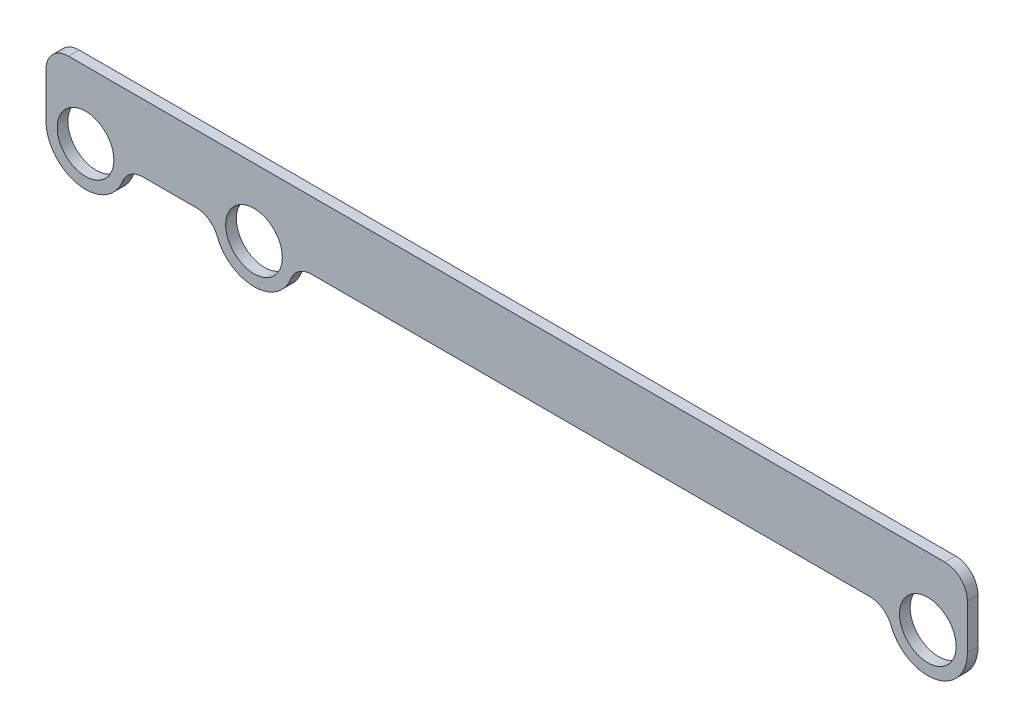
ISO-10303-21;
HEADER;
FILE_DESCRIPTION(('STEP AP214'),'2;1');
FILE_NAME('part.step','',(''),(''),'','','');
FILE_SCHEMA(('AUTOMOTIVE_DESIGN { 1 0 10303 214 1 1 1 1 }'));
ENDSEC;
DATA;
#1=APPLICATION_CONTEXT('core data for automotive mechanical design processes');
#2=APPLICATION_PROTOCOL_DEFINITION('international standard','automotive_design',2000,#1);
#3=PRODUCT_CONTEXT('',#1,'mechanical');
#4=PRODUCT('Part','Part','',(#3));
#5=PRODUCT_RELATED_PRODUCT_CATEGORY('part','',(#4));
#6=PRODUCT_DEFINITION_FORMATION('','',#4);
#7=PRODUCT_DEFINITION_CONTEXT('part definition',#1,'design');
#8=PRODUCT_DEFINITION('design','',#6,#7);
#9=PRODUCT_DEFINITION_SHAPE('','',#8);
#10=(LENGTH_UNIT() NAMED_UNIT(*) SI_UNIT(.MILLI.,.METRE.));
#11=(NAMED_UNIT(*) PLANE_ANGLE_UNIT() SI_UNIT($,.RADIAN.));
#12=(NAMED_UNIT(*) SI_UNIT($,.STERADIAN.) SOLID_ANGLE_UNIT());
#13=UNCERTAINTY_MEASURE_WITH_UNIT(LENGTH_MEASURE(1.E-05),#10,'distance_accuracy_value','');
#14=(GEOMETRIC_REPRESENTATION_CONTEXT(3) GLOBAL_UNCERTAINTY_ASSIGNED_CONTEXT((#13)) GLOBAL_UNIT_ASSIGNED_CONTEXT((#10,
#11,#12)) REPRESENTATION_CONTEXT('',''));
#15=CARTESIAN_POINT('',(0.,0.,0.));
#16=DIRECTION('',(0.,0.,1.));
#17=DIRECTION('',(1.,0.,0.));
#18=AXIS2_PLACEMENT_3D('',#15,#16,#17);
#19=CARTESIAN_POINT('',(375.13611527834,-12.8083458350186,-9.5));
#20=DIRECTION('',(0.,0.,1.));
#21=DIRECTION('',(1.,0.,0.));
#22=AXIS2_PLACEMENT_3D('',#19,#20,#21);
#23=CYLINDRICAL_SURFACE('',#22,35.1999999999999);
#24=CARTESIAN_POINT('',(375.13611527834,-12.8083458350186,0.));
#25=DIRECTION('',(0.,0.,1.));
#26=DIRECTION('',(1.,0.,0.));
#27=AXIS2_PLACEMENT_3D('',#24,#25,#26);
#28=CIRCLE('',#27,35.1999999999999);
#29=CARTESIAN_POINT('',(342.327806946941,-25.5619690234244,0.));
#30=VERTEX_POINT('',#29);
#31=CARTESIAN_POINT('',(410.33611527834,-12.8083458350186,0.));
#32=VERTEX_POINT('',#31);
#33=EDGE_CURVE('E189',#30,#32,#28,.T.);
#34=ORIENTED_EDGE('',*,*,#33,.F.);
#35=DIRECTION('',(0.,0.,1.));
#36=VECTOR('',#35,1.);
#37=CARTESIAN_POINT('',(342.327806946941,-25.5619690234244,-9.5));
#38=LINE('',#37,#36);
#39=CARTESIAN_POINT('',(342.327806946941,-25.5619690234244,-9.5));
#40=VERTEX_POINT('',#39);
#41=EDGE_CURVE('E153',#30,#40,#38,.F.);
#42=ORIENTED_EDGE('',*,*,#41,.T.);
#43=CARTESIAN_POINT('',(375.13611527834,-12.8083458350186,-9.5));
#44=DIRECTION('',(0.,0.,1.));
#45=DIRECTION('',(1.,0.,0.));
#46=AXIS2_PLACEMENT_3D('',#43,#44,#45);
#47=CIRCLE('',#46,35.1999999999999);
#48=CARTESIAN_POINT('',(410.33611527834,-12.8083458350186,-9.5));
#49=VERTEX_POINT('',#48);
#50=EDGE_CURVE('E150',#40,#49,#47,.T.);
#51=ORIENTED_EDGE('',*,*,#50,.T.);
#52=DIRECTION('',(0.,0.,1.));
#53=VECTOR('',#52,1.);
#54=CARTESIAN_POINT('',(410.33611527834,-12.8083458350186,-9.5));
#55=LINE('',#54,#53);
#56=EDGE_CURVE('E147',#49,#32,#55,.T.);
#57=ORIENTED_EDGE('',*,*,#56,.T.);
#58=EDGE_LOOP('',(#34,#42,#51,#57));
#59=FACE_BOUND('',#58,.T.);
#60=ADVANCED_FACE('F44',(#59),#23,.T.);
#61=CARTESIAN_POINT('',(-189.66388472166,-12.8083458350188,-9.5));
#62=DIRECTION('',(0.,-1.,0.));
#63=DIRECTION('',(1.,0.,0.));
#64=AXIS2_PLACEMENT_3D('',#61,#62,#63);
#65=PLANE('',#64);
#66=DIRECTION('',(1.,0.,0.));
#67=VECTOR('',#66,1.);
#68=CARTESIAN_POINT('',(-189.66388472166,-12.8083458350188,-9.5));
#69=LINE('',#68,#67);
#70=CARTESIAN_POINT('',(-173.414492111057,-12.8083458350188,-9.5));
#71=VERTEX_POINT('',#70);
#72=CARTESIAN_POINT('',(323.686722667737,-12.8083458350186,-9.5));
#73=VERTEX_POINT('',#72);
#74=EDGE_CURVE('E170',#71,#73,#69,.T.);
#75=ORIENTED_EDGE('',*,*,#74,.T.);
#76=DIRECTION('',(0.,0.,-1.));
#77=VECTOR('',#76,1.);
#78=CARTESIAN_POINT('',(323.686722667737,-12.8083458350186,0.));
#79=LINE('',#78,#77);
#80=CARTESIAN_POINT('',(323.686722667737,-12.8083458350186,0.));
#81=VERTEX_POINT('',#80);
#82=EDGE_CURVE('E212',#73,#81,#79,.F.);
#83=ORIENTED_EDGE('',*,*,#82,.T.);
#84=DIRECTION('',(1.,0.,0.));
#85=VECTOR('',#84,1.);
#86=CARTESIAN_POINT('',(-189.66388472166,-12.8083458350188,0.));
#87=LINE('',#86,#85);
#88=CARTESIAN_POINT('',(-173.414492111057,-12.8083458350188,0.));
#89=VERTEX_POINT('',#88);
#90=EDGE_CURVE('E160',#89,#81,#87,.T.);
#91=ORIENTED_EDGE('',*,*,#90,.F.);
#92=DIRECTION('',(0.,0.,-1.));
#93=VECTOR('',#92,1.);
#94=CARTESIAN_POINT('',(-173.414492111057,-12.8083458350188,-9.5));
#95=LINE('',#94,#93);
#96=EDGE_CURVE('E211',#89,#71,#95,.T.);
#97=ORIENTED_EDGE('',*,*,#96,.T.);
#98=EDGE_LOOP('',(#75,#83,#91,#97));
#99=FACE_BOUND('',#98,.T.);
#100=ADVANCED_FACE('F289',(#99),#65,.T.);
#101=CARTESIAN_POINT('',(-224.86388472166,-12.8083458350188,-9.5));
#102=DIRECTION('',(0.,0.,1.));
#103=DIRECTION('',(1.,0.,0.));
#104=AXIS2_PLACEMENT_3D('',#101,#102,#103);
#105=CYLINDRICAL_SURFACE('',#104,35.1999999999999);
#106=CARTESIAN_POINT('',(-224.86388472166,-12.8083458350188,-9.5));
#107=DIRECTION('',(0.,0.,1.));
#108=DIRECTION('',(1.,0.,0.));
#109=AXIS2_PLACEMENT_3D('',#106,#107,#108);
#110=CIRCLE('',#109,35.1999999999999);
#111=CARTESIAN_POINT('',(-257.672193053059,-25.5619690234246,-9.5));
#112=VERTEX_POINT('',#111);
#113=CARTESIAN_POINT('',(-192.055576390261,-25.5619690234246,-9.5));
#114=VERTEX_POINT('',#113);
#115=EDGE_CURVE('E183',#112,#114,#110,.T.);
#116=ORIENTED_EDGE('',*,*,#115,.T.);
#117=DIRECTION('',(0.,0.,1.));
#118=VECTOR('',#117,1.);
#119=CARTESIAN_POINT('',(-192.055576390261,-25.5619690234246,-9.5));
#120=LINE('',#119,#118);
#121=CARTESIAN_POINT('',(-192.055576390261,-25.5619690234246,0.));
#122=VERTEX_POINT('',#121);
#123=EDGE_CURVE('E219',#114,#122,#120,.T.);
#124=ORIENTED_EDGE('',*,*,#123,.T.);
#125=CARTESIAN_POINT('',(-224.86388472166,-12.8083458350188,0.));
#126=DIRECTION('',(0.,0.,1.));
#127=DIRECTION('',(1.,0.,0.));
#128=AXIS2_PLACEMENT_3D('',#125,#126,#127);
#129=CIRCLE('',#128,35.1999999999999);
#130=CARTESIAN_POINT('',(-257.672193053059,-25.5619690234246,0.));
#131=VERTEX_POINT('',#130);
#132=EDGE_CURVE('E202',#131,#122,#129,.T.);
#133=ORIENTED_EDGE('',*,*,#132,.F.);
#134=DIRECTION('',(0.,0.,1.));
#135=VECTOR('',#134,1.);
#136=CARTESIAN_POINT('',(-257.672193053059,-25.5619690234246,-9.5));
#137=LINE('',#136,#135);
#138=EDGE_CURVE('E217',#131,#112,#137,.F.);
#139=ORIENTED_EDGE('',*,*,#138,.T.);
#140=EDGE_LOOP('',(#116,#124,#133,#139));
#141=FACE_BOUND('',#140,.T.);
#142=ADVANCED_FACE('F296',(#141),#105,.T.);
#143=CARTESIAN_POINT('',(-339.66388472166,-12.8083458350189,-9.5));
#144=DIRECTION('',(0.,-1.,0.));
#145=DIRECTION('',(1.,0.,0.));
#146=AXIS2_PLACEMENT_3D('',#143,#144,#145);
#147=PLANE('',#146);
#148=DIRECTION('',(1.,0.,0.));
#149=VECTOR('',#148,1.);
#150=CARTESIAN_POINT('',(-339.66388472166,-12.8083458350189,-9.5));
#151=LINE('',#150,#149);
#152=CARTESIAN_POINT('',(-323.414492111057,-12.8083458350189,-9.5));
#153=VERTEX_POINT('',#152);
#154=CARTESIAN_POINT('',(-276.313277332263,-12.8083458350188,-9.5));
#155=VERTEX_POINT('',#154);
#156=EDGE_CURVE('E185',#153,#155,#151,.T.);
#157=ORIENTED_EDGE('',*,*,#156,.T.);
#158=DIRECTION('',(0.,0.,-1.));
#159=VECTOR('',#158,1.);
#160=CARTESIAN_POINT('',(-276.313277332263,-12.8083458350188,0.));
#161=LINE('',#160,#159);
#162=CARTESIAN_POINT('',(-276.313277332263,-12.8083458350188,0.));
#163=VERTEX_POINT('',#162);
#164=EDGE_CURVE('E223',#155,#163,#161,.F.);
#165=ORIENTED_EDGE('',*,*,#164,.T.);
#166=DIRECTION('',(1.,0.,0.));
#167=VECTOR('',#166,1.);
#168=CARTESIAN_POINT('',(-339.66388472166,-12.8083458350189,0.));
#169=LINE('',#168,#167);
#170=CARTESIAN_POINT('',(-323.414492111057,-12.8083458350189,0.));
#171=VERTEX_POINT('',#170);
#172=EDGE_CURVE('E205',#171,#163,#169,.T.);
#173=ORIENTED_EDGE('',*,*,#172,.F.);
#174=DIRECTION('',(0.,0.,-1.));
#175=VECTOR('',#174,1.);
#176=CARTESIAN_POINT('',(-323.414492111057,-12.8083458350189,-9.5));
#177=LINE('',#176,#175);
#178=EDGE_CURVE('E224',#171,#153,#177,.T.);
#179=ORIENTED_EDGE('',*,*,#178,.T.);
#180=EDGE_LOOP('',(#157,#165,#173,#179));
#181=FACE_BOUND('',#180,.T.);
#182=ADVANCED_FACE('F262',(#181),#147,.T.);
#183=CARTESIAN_POINT('',(-374.86388472166,-12.8083458350189,-9.5));
#184=DIRECTION('',(0.,0.,1.));
#185=DIRECTION('',(1.,0.,0.));
#186=AXIS2_PLACEMENT_3D('',#183,#184,#185);
#187=CYLINDRICAL_SURFACE('',#186,35.2);
#188=CARTESIAN_POINT('',(-374.86388472166,-12.8083458350189,-9.5));
#189=DIRECTION('',(0.,0.,1.));
#190=DIRECTION('',(1.,0.,0.));
#191=AXIS2_PLACEMENT_3D('',#188,#189,#190);
#192=CIRCLE('',#191,35.2);
#193=CARTESIAN_POINT('',(-410.06388472166,-12.8083458350189,-9.5));
#194=VERTEX_POINT('',#193);
#195=CARTESIAN_POINT('',(-342.055576390261,-25.5619690234247,-9.5));
#196=VERTEX_POINT('',#195);
#197=EDGE_CURVE('E177',#194,#196,#192,.T.);
#198=ORIENTED_EDGE('',*,*,#197,.T.);
#199=DIRECTION('',(0.,0.,1.));
#200=VECTOR('',#199,1.);
#201=CARTESIAN_POINT('',(-342.055576390261,-25.5619690234247,-9.5));
#202=LINE('',#201,#200);
#203=CARTESIAN_POINT('',(-342.055576390261,-25.5619690234247,0.));
#204=VERTEX_POINT('',#203);
#205=EDGE_CURVE('E227',#196,#204,#202,.T.);
#206=ORIENTED_EDGE('',*,*,#205,.T.);
#207=CARTESIAN_POINT('',(-374.86388472166,-12.8083458350189,0.));
#208=DIRECTION('',(0.,0.,1.));
#209=DIRECTION('',(1.,0.,0.));
#210=AXIS2_PLACEMENT_3D('',#207,#208,#209);
#211=CIRCLE('',#210,35.2);
#212=CARTESIAN_POINT('',(-410.06388472166,-12.8083458350189,0.));
#213=VERTEX_POINT('',#212);
#214=EDGE_CURVE('E200',#213,#204,#211,.T.);
#215=ORIENTED_EDGE('',*,*,#214,.F.);
#216=DIRECTION('',(0.,0.,1.));
#217=VECTOR('',#216,1.);
#218=CARTESIAN_POINT('',(-410.06388472166,-12.8083458350189,-9.5));
#219=LINE('',#218,#217);
#220=EDGE_CURVE('E167',#194,#213,#219,.T.);
#221=ORIENTED_EDGE('',*,*,#220,.F.);
#222=EDGE_LOOP('',(#198,#206,#215,#221));
#223=FACE_BOUND('',#222,.T.);
#224=ADVANCED_FACE('F275',(#223),#187,.T.);
#225=CARTESIAN_POINT('',(-410.06388472166,47.1916541649812,-9.5));
#226=DIRECTION('',(-1.,0.,0.));
#227=DIRECTION('',(0.,0.,1.));
#228=AXIS2_PLACEMENT_3D('',#225,#226,#227);
#229=PLANE('',#228);
#230=DIRECTION('',(0.,-1.,0.));
#231=VECTOR('',#230,1.);
#232=CARTESIAN_POINT('',(-410.06388472166,47.1916541649812,0.));
#233=LINE('',#232,#231);
#234=CARTESIAN_POINT('',(-410.06388472166,27.1916541649812,0.));
#235=VERTEX_POINT('',#234);
#236=EDGE_CURVE('E197',#235,#213,#233,.T.);
#237=ORIENTED_EDGE('',*,*,#236,.F.);
#238=DIRECTION('',(0.,0.,1.));
#239=VECTOR('',#238,1.);
#240=CARTESIAN_POINT('',(-410.06388472166,27.1916541649812,-9.5));
#241=LINE('',#240,#239);
#242=CARTESIAN_POINT('',(-410.06388472166,27.1916541649812,-9.5));
#243=VERTEX_POINT('',#242);
#244=EDGE_CURVE('E58',#235,#243,#241,.F.);
#245=ORIENTED_EDGE('',*,*,#244,.T.);
#246=DIRECTION('',(0.,-1.,0.));
#247=VECTOR('',#246,1.);
#248=CARTESIAN_POINT('',(-410.06388472166,47.1916541649812,-9.5));
#249=LINE('',#248,#247);
#250=EDGE_CURVE('E175',#243,#194,#249,.T.);
#251=ORIENTED_EDGE('',*,*,#250,.T.);
#252=ORIENTED_EDGE('',*,*,#220,.T.);
#253=EDGE_LOOP('',(#237,#245,#251,#252));
#254=FACE_BOUND('',#253,.T.);
#255=ADVANCED_FACE('F272',(#254),#229,.T.);
#256=CARTESIAN_POINT('',(410.33611527834,47.1916541649812,-9.5));
#257=DIRECTION('',(0.,1.,0.));
#258=DIRECTION('',(0.,0.,1.));
#259=AXIS2_PLACEMENT_3D('',#256,#257,#258);
#260=PLANE('',#259);
#261=DIRECTION('',(-1.,0.,0.));
#262=VECTOR('',#261,1.);
#263=CARTESIAN_POINT('',(410.33611527834,47.1916541649812,0.));
#264=LINE('',#263,#262);
#265=CARTESIAN_POINT('',(390.33611527834,47.1916541649812,0.));
#266=VERTEX_POINT('',#265);
#267=CARTESIAN_POINT('',(-390.06388472166,47.1916541649812,0.));
#268=VERTEX_POINT('',#267);
#269=EDGE_CURVE('E192',#266,#268,#264,.T.);
#270=ORIENTED_EDGE('',*,*,#269,.F.);
#271=DIRECTION('',(0.,0.,1.));
#272=VECTOR('',#271,1.);
#273=CARTESIAN_POINT('',(390.33611527834,47.1916541649812,-9.5));
#274=LINE('',#273,#272);
#275=CARTESIAN_POINT('',(390.33611527834,47.1916541649812,-9.5));
#276=VERTEX_POINT('',#275);
#277=EDGE_CURVE('E238',#266,#276,#274,.F.);
#278=ORIENTED_EDGE('',*,*,#277,.T.);
#279=DIRECTION('',(-1.,0.,0.));
#280=VECTOR('',#279,1.);
#281=CARTESIAN_POINT('',(410.33611527834,47.1916541649812,-9.5));
#282=LINE('',#281,#280);
#283=CARTESIAN_POINT('',(-390.06388472166,47.1916541649812,-9.5));
#284=VERTEX_POINT('',#283);
#285=EDGE_CURVE('E174',#276,#284,#282,.T.);
#286=ORIENTED_EDGE('',*,*,#285,.T.);
#287=DIRECTION('',(0.,0.,1.));
#288=VECTOR('',#287,1.);
#289=CARTESIAN_POINT('',(-390.06388472166,47.1916541649812,-9.5));
#290=LINE('',#289,#288);
#291=EDGE_CURVE('E240',#284,#268,#290,.T.);
#292=ORIENTED_EDGE('',*,*,#291,.T.);
#293=EDGE_LOOP('',(#270,#278,#286,#292));
#294=FACE_BOUND('',#293,.T.);
#295=ADVANCED_FACE('F279',(#294),#260,.T.);
#296=CARTESIAN_POINT('',(410.33611527834,-12.8083458350186,-9.5));
#297=DIRECTION('',(1.,0.,0.));
#298=DIRECTION('',(0.,0.,-1.));
#299=AXIS2_PLACEMENT_3D('',#296,#297,#298);
#300=PLANE('',#299);
#301=DIRECTION('',(0.,1.,0.));
#302=VECTOR('',#301,1.);
#303=CARTESIAN_POINT('',(410.33611527834,-12.8083458350186,-9.5));
#304=LINE('',#303,#302);
#305=CARTESIAN_POINT('',(410.33611527834,27.1916541649812,-9.5));
#306=VERTEX_POINT('',#305);
#307=EDGE_CURVE('E156',#49,#306,#304,.T.);
#308=ORIENTED_EDGE('',*,*,#307,.T.);
#309=DIRECTION('',(0.,0.,1.));
#310=VECTOR('',#309,1.);
#311=CARTESIAN_POINT('',(410.33611527834,27.1916541649812,-9.5));
#312=LINE('',#311,#310);
#313=CARTESIAN_POINT('',(410.33611527834,27.1916541649812,0.));
#314=VERTEX_POINT('',#313);
#315=EDGE_CURVE('E231',#306,#314,#312,.T.);
#316=ORIENTED_EDGE('',*,*,#315,.T.);
#317=DIRECTION('',(0.,1.,0.));
#318=VECTOR('',#317,1.);
#319=CARTESIAN_POINT('',(410.33611527834,-12.8083458350186,0.));
#320=LINE('',#319,#318);
#321=EDGE_CURVE('E164',#32,#314,#320,.T.);
#322=ORIENTED_EDGE('',*,*,#321,.F.);
#323=ORIENTED_EDGE('',*,*,#56,.F.);
#324=EDGE_LOOP('',(#308,#316,#322,#323));
#325=FACE_BOUND('',#324,.T.);
#326=ADVANCED_FACE('F161',(#325),#300,.T.);
#327=CARTESIAN_POINT('',(375.13611527834,-12.8083458350186,-9.5));
#328=DIRECTION('',(0.,0.,1.));
#329=DIRECTION('',(1.,0.,0.));
#330=AXIS2_PLACEMENT_3D('',#327,#328,#329);
#331=PLANE('',#330);
#332=CARTESIAN_POINT('',(-374.86388472166,-12.8083458350189,-9.5));
#333=DIRECTION('',(0.,0.,1.));
#334=DIRECTION('',(1.,0.,0.));
#335=AXIS2_PLACEMENT_3D('',#332,#333,#334);
#336=CIRCLE('',#335,25.2);
#337=CARTESIAN_POINT('',(-349.66388472166,-12.8083458350189,-9.5));
#338=VERTEX_POINT('',#337);
#339=EDGE_CURVE('E368',#338,#338,#336,.T.);
#340=ORIENTED_EDGE('',*,*,#339,.T.);
#341=EDGE_LOOP('',(#340));
#342=FACE_BOUND('',#341,.T.);
#343=CARTESIAN_POINT('',(-224.86388472166,-12.8083458350188,-9.5));
#344=DIRECTION('',(0.,0.,1.));
#345=DIRECTION('',(1.,0.,0.));
#346=AXIS2_PLACEMENT_3D('',#343,#344,#345);
#347=CIRCLE('',#346,25.1999999999999);
#348=CARTESIAN_POINT('',(-199.66388472166,-12.8083458350188,-9.5));
#349=VERTEX_POINT('',#348);
#350=EDGE_CURVE('E372',#349,#349,#347,.T.);
#351=ORIENTED_EDGE('',*,*,#350,.T.);
#352=EDGE_LOOP('',(#351));
#353=FACE_BOUND('',#352,.T.);
#354=CARTESIAN_POINT('',(375.13611527834,-12.8083458350186,-9.5));
#355=DIRECTION('',(0.,0.,1.));
#356=DIRECTION('',(1.,0.,0.));
#357=AXIS2_PLACEMENT_3D('',#354,#355,#356);
#358=CIRCLE('',#357,25.1999999999999);
#359=CARTESIAN_POINT('',(400.33611527834,-12.8083458350186,-9.5));
#360=VERTEX_POINT('',#359);
#361=EDGE_CURVE('E195',#360,#360,#358,.T.);
#362=ORIENTED_EDGE('',*,*,#361,.T.);
#363=EDGE_LOOP('',(#362));
#364=FACE_BOUND('',#363,.T.);
#365=ORIENTED_EDGE('',*,*,#285,.F.);
#366=CARTESIAN_POINT('',(390.33611527834,27.1916541649812,-9.5));
#367=DIRECTION('',(0.,0.,1.));
#368=DIRECTION('',(1.,0.,0.));
#369=AXIS2_PLACEMENT_3D('',#366,#367,#368);
#370=CIRCLE('',#369,20.);
#371=EDGE_CURVE('E173',#276,#306,#370,.F.);
#372=ORIENTED_EDGE('',*,*,#371,.T.);
#373=ORIENTED_EDGE('',*,*,#307,.F.);
#374=ORIENTED_EDGE('',*,*,#50,.F.);
#375=CARTESIAN_POINT('',(323.686722667737,-32.8083458350186,-9.5));
#376=DIRECTION('',(0.,0.,1.));
#377=DIRECTION('',(1.,0.,0.));
#378=AXIS2_PLACEMENT_3D('',#375,#376,#377);
#379=CIRCLE('',#378,20.);
#380=EDGE_CURVE('E250',#40,#73,#379,.T.);
#381=ORIENTED_EDGE('',*,*,#380,.T.);
#382=ORIENTED_EDGE('',*,*,#74,.F.);
#383=CARTESIAN_POINT('',(-173.414492111057,-32.8083458350188,-9.5));
#384=DIRECTION('',(0.,0.,1.));
#385=DIRECTION('',(1.,0.,0.));
#386=AXIS2_PLACEMENT_3D('',#383,#384,#385);
#387=CIRCLE('',#386,20.);
#388=EDGE_CURVE('E253',#71,#114,#387,.T.);
#389=ORIENTED_EDGE('',*,*,#388,.T.);
#390=ORIENTED_EDGE('',*,*,#115,.F.);
#391=CARTESIAN_POINT('',(-276.313277332263,-32.8083458350188,-9.5));
#392=DIRECTION('',(0.,0.,1.));
#393=DIRECTION('',(1.,0.,0.));
#394=AXIS2_PLACEMENT_3D('',#391,#392,#393);
#395=CIRCLE('',#394,20.);
#396=EDGE_CURVE('E254',#112,#155,#395,.T.);
#397=ORIENTED_EDGE('',*,*,#396,.T.);
#398=ORIENTED_EDGE('',*,*,#156,.F.);
#399=CARTESIAN_POINT('',(-323.414492111057,-32.8083458350189,-9.5));
#400=DIRECTION('',(0.,0.,1.));
#401=DIRECTION('',(1.,0.,0.));
#402=AXIS2_PLACEMENT_3D('',#399,#400,#401);
#403=CIRCLE('',#402,20.);
#404=EDGE_CURVE('E11',#153,#196,#403,.T.);
#405=ORIENTED_EDGE('',*,*,#404,.T.);
#406=ORIENTED_EDGE('',*,*,#197,.F.);
#407=ORIENTED_EDGE('',*,*,#250,.F.);
#408=CARTESIAN_POINT('',(-390.06388472166,27.1916541649812,-9.5));
#409=DIRECTION('',(0.,0.,1.));
#410=DIRECTION('',(1.,0.,0.));
#411=AXIS2_PLACEMENT_3D('',#408,#409,#410);
#412=CIRCLE('',#411,20.);
#413=EDGE_CURVE('E70',#243,#284,#412,.F.);
#414=ORIENTED_EDGE('',*,*,#413,.T.);
#415=EDGE_LOOP('',(#365,#372,#373,#374,#381,#382,#389,#390,#397,#398,#405,#406,#407,#414));
#416=FACE_BOUND('',#415,.T.);
#417=ADVANCED_FACE('F166',(#342,#353,#364,#416),#331,.F.);
#418=CARTESIAN_POINT('',(375.13611527834,-12.8083458350186,0.));
#419=DIRECTION('',(0.,0.,1.));
#420=DIRECTION('',(1.,0.,0.));
#421=AXIS2_PLACEMENT_3D('',#418,#419,#420);
#422=PLANE('',#421);
#423=CARTESIAN_POINT('',(-374.86388472166,-12.8083458350189,0.));
#424=DIRECTION('',(0.,0.,1.));
#425=DIRECTION('',(1.,0.,0.));
#426=AXIS2_PLACEMENT_3D('',#423,#424,#425);
#427=CIRCLE('',#426,25.2);
#428=CARTESIAN_POINT('',(-349.66388472166,-12.8083458350189,0.));
#429=VERTEX_POINT('',#428);
#430=EDGE_CURVE('E369',#429,#429,#427,.T.);
#431=ORIENTED_EDGE('',*,*,#430,.F.);
#432=EDGE_LOOP('',(#431));
#433=FACE_BOUND('',#432,.T.);
#434=CARTESIAN_POINT('',(-224.86388472166,-12.8083458350188,0.));
#435=DIRECTION('',(0.,0.,1.));
#436=DIRECTION('',(1.,0.,0.));
#437=AXIS2_PLACEMENT_3D('',#434,#435,#436);
#438=CIRCLE('',#437,25.1999999999999);
#439=CARTESIAN_POINT('',(-199.66388472166,-12.8083458350188,0.));
#440=VERTEX_POINT('',#439);
#441=EDGE_CURVE('E371',#440,#440,#438,.T.);
#442=ORIENTED_EDGE('',*,*,#441,.F.);
#443=EDGE_LOOP('',(#442));
#444=FACE_BOUND('',#443,.T.);
#445=CARTESIAN_POINT('',(375.13611527834,-12.8083458350186,0.));
#446=DIRECTION('',(0.,0.,1.));
#447=DIRECTION('',(1.,0.,0.));
#448=AXIS2_PLACEMENT_3D('',#445,#446,#447);
#449=CIRCLE('',#448,25.1999999999999);
#450=CARTESIAN_POINT('',(400.33611527834,-12.8083458350186,0.));
#451=VERTEX_POINT('',#450);
#452=EDGE_CURVE('E380',#451,#451,#449,.T.);
#453=ORIENTED_EDGE('',*,*,#452,.F.);
#454=EDGE_LOOP('',(#453));
#455=FACE_BOUND('',#454,.T.);
#456=ORIENTED_EDGE('',*,*,#321,.T.);
#457=CARTESIAN_POINT('',(390.33611527834,27.1916541649812,0.));
#458=DIRECTION('',(0.,0.,1.));
#459=DIRECTION('',(1.,0.,0.));
#460=AXIS2_PLACEMENT_3D('',#457,#458,#459);
#461=CIRCLE('',#460,20.);
#462=EDGE_CURVE('E234',#314,#266,#461,.T.);
#463=ORIENTED_EDGE('',*,*,#462,.T.);
#464=ORIENTED_EDGE('',*,*,#269,.T.);
#465=CARTESIAN_POINT('',(-390.06388472166,27.1916541649812,0.));
#466=DIRECTION('',(0.,0.,1.));
#467=DIRECTION('',(1.,0.,0.));
#468=AXIS2_PLACEMENT_3D('',#465,#466,#467);
#469=CIRCLE('',#468,20.);
#470=EDGE_CURVE('E233',#268,#235,#469,.T.);
#471=ORIENTED_EDGE('',*,*,#470,.T.);
#472=ORIENTED_EDGE('',*,*,#236,.T.);
#473=ORIENTED_EDGE('',*,*,#214,.T.);
#474=CARTESIAN_POINT('',(-323.414492111057,-32.8083458350189,0.));
#475=DIRECTION('',(0.,0.,1.));
#476=DIRECTION('',(1.,0.,0.));
#477=AXIS2_PLACEMENT_3D('',#474,#475,#476);
#478=CIRCLE('',#477,20.);
#479=EDGE_CURVE('E52',#204,#171,#478,.F.);
#480=ORIENTED_EDGE('',*,*,#479,.T.);
#481=ORIENTED_EDGE('',*,*,#172,.T.);
#482=CARTESIAN_POINT('',(-276.313277332263,-32.8083458350188,0.));
#483=DIRECTION('',(0.,0.,1.));
#484=DIRECTION('',(1.,0.,0.));
#485=AXIS2_PLACEMENT_3D('',#482,#483,#484);
#486=CIRCLE('',#485,20.);
#487=EDGE_CURVE('E251',#163,#131,#486,.F.);
#488=ORIENTED_EDGE('',*,*,#487,.T.);
#489=ORIENTED_EDGE('',*,*,#132,.T.);
#490=CARTESIAN_POINT('',(-173.414492111057,-32.8083458350188,0.));
#491=DIRECTION('',(0.,0.,1.));
#492=DIRECTION('',(1.,0.,0.));
#493=AXIS2_PLACEMENT_3D('',#490,#491,#492);
#494=CIRCLE('',#493,20.);
#495=EDGE_CURVE('E247',#122,#89,#494,.F.);
#496=ORIENTED_EDGE('',*,*,#495,.T.);
#497=ORIENTED_EDGE('',*,*,#90,.T.);
#498=CARTESIAN_POINT('',(323.686722667737,-32.8083458350186,0.));
#499=DIRECTION('',(0.,0.,1.));
#500=DIRECTION('',(1.,0.,0.));
#501=AXIS2_PLACEMENT_3D('',#498,#499,#500);
#502=CIRCLE('',#501,20.);
#503=EDGE_CURVE('E244',#81,#30,#502,.F.);
#504=ORIENTED_EDGE('',*,*,#503,.T.);
#505=ORIENTED_EDGE('',*,*,#33,.T.);
#506=EDGE_LOOP('',(#456,#463,#464,#471,#472,#473,#480,#481,#488,#489,#496,#497,#504,#505));
#507=FACE_BOUND('',#506,.T.);
#508=ADVANCED_FACE('F256',(#433,#444,#455,#507),#422,.T.);
#509=CARTESIAN_POINT('',(375.13611527834,-12.8083458350186,-9.5));
#510=DIRECTION('',(0.,0.,1.));
#511=DIRECTION('',(1.,0.,0.));
#512=AXIS2_PLACEMENT_3D('',#509,#510,#511);
#513=CYLINDRICAL_SURFACE('',#512,25.1999999999999);
#514=ORIENTED_EDGE('',*,*,#361,.F.);
#515=EDGE_LOOP('',(#514));
#516=FACE_BOUND('',#515,.T.);
#517=ORIENTED_EDGE('',*,*,#452,.T.);
#518=EDGE_LOOP('',(#517));
#519=FACE_BOUND('',#518,.T.);
#520=ADVANCED_FACE('F349',(#516,#519),#513,.F.);
#521=CARTESIAN_POINT('',(-224.86388472166,-12.8083458350188,-9.5));
#522=DIRECTION('',(0.,0.,1.));
#523=DIRECTION('',(1.,0.,0.));
#524=AXIS2_PLACEMENT_3D('',#521,#522,#523);
#525=CYLINDRICAL_SURFACE('',#524,25.1999999999999);
#526=ORIENTED_EDGE('',*,*,#350,.F.);
#527=EDGE_LOOP('',(#526));
#528=FACE_BOUND('',#527,.T.);
#529=ORIENTED_EDGE('',*,*,#441,.T.);
#530=EDGE_LOOP('',(#529));
#531=FACE_BOUND('',#530,.T.);
#532=ADVANCED_FACE('F358',(#528,#531),#525,.F.);
#533=CARTESIAN_POINT('',(-374.86388472166,-12.8083458350189,-9.5));
#534=DIRECTION('',(0.,0.,1.));
#535=DIRECTION('',(1.,0.,0.));
#536=AXIS2_PLACEMENT_3D('',#533,#534,#535);
#537=CYLINDRICAL_SURFACE('',#536,25.2);
#538=ORIENTED_EDGE('',*,*,#339,.F.);
#539=EDGE_LOOP('',(#538));
#540=FACE_BOUND('',#539,.T.);
#541=ORIENTED_EDGE('',*,*,#430,.T.);
#542=EDGE_LOOP('',(#541));
#543=FACE_BOUND('',#542,.T.);
#544=ADVANCED_FACE('F308',(#540,#543),#537,.F.);
#545=CARTESIAN_POINT('',(323.686722667737,-32.8083458350186,-9.5));
#546=DIRECTION('',(0.,0.,1.));
#547=DIRECTION('',(1.,0.,0.));
#548=AXIS2_PLACEMENT_3D('',#545,#546,#547);
#549=CYLINDRICAL_SURFACE('',#548,20.);
#550=ORIENTED_EDGE('',*,*,#380,.F.);
#551=ORIENTED_EDGE('',*,*,#41,.F.);
#552=ORIENTED_EDGE('',*,*,#503,.F.);
#553=ORIENTED_EDGE('',*,*,#82,.F.);
#554=EDGE_LOOP('',(#550,#551,#552,#553));
#555=FACE_BOUND('',#554,.T.);
#556=ADVANCED_FACE('F305',(#555),#549,.F.);
#557=CARTESIAN_POINT('',(-173.414492111057,-32.8083458350188,-9.5));
#558=DIRECTION('',(0.,0.,1.));
#559=DIRECTION('',(1.,0.,0.));
#560=AXIS2_PLACEMENT_3D('',#557,#558,#559);
#561=CYLINDRICAL_SURFACE('',#560,20.);
#562=ORIENTED_EDGE('',*,*,#388,.F.);
#563=ORIENTED_EDGE('',*,*,#96,.F.);
#564=ORIENTED_EDGE('',*,*,#495,.F.);
#565=ORIENTED_EDGE('',*,*,#123,.F.);
#566=EDGE_LOOP('',(#562,#563,#564,#565));
#567=FACE_BOUND('',#566,.T.);
#568=ADVANCED_FACE('F304',(#567),#561,.F.);
#569=CARTESIAN_POINT('',(-276.313277332263,-32.8083458350188,-9.5));
#570=DIRECTION('',(0.,0.,1.));
#571=DIRECTION('',(1.,0.,0.));
#572=AXIS2_PLACEMENT_3D('',#569,#570,#571);
#573=CYLINDRICAL_SURFACE('',#572,20.);
#574=ORIENTED_EDGE('',*,*,#396,.F.);
#575=ORIENTED_EDGE('',*,*,#138,.F.);
#576=ORIENTED_EDGE('',*,*,#487,.F.);
#577=ORIENTED_EDGE('',*,*,#164,.F.);
#578=EDGE_LOOP('',(#574,#575,#576,#577));
#579=FACE_BOUND('',#578,.T.);
#580=ADVANCED_FACE('F290',(#579),#573,.F.);
#581=CARTESIAN_POINT('',(-323.414492111057,-32.8083458350189,-9.5));
#582=DIRECTION('',(0.,0.,1.));
#583=DIRECTION('',(1.,0.,0.));
#584=AXIS2_PLACEMENT_3D('',#581,#582,#583);
#585=CYLINDRICAL_SURFACE('',#584,20.);
#586=ORIENTED_EDGE('',*,*,#404,.F.);
#587=ORIENTED_EDGE('',*,*,#178,.F.);
#588=ORIENTED_EDGE('',*,*,#479,.F.);
#589=ORIENTED_EDGE('',*,*,#205,.F.);
#590=EDGE_LOOP('',(#586,#587,#588,#589));
#591=FACE_BOUND('',#590,.T.);
#592=ADVANCED_FACE('F268',(#591),#585,.F.);
#593=CARTESIAN_POINT('',(390.33611527834,27.1916541649812,-9.5));
#594=DIRECTION('',(0.,0.,1.));
#595=DIRECTION('',(1.,0.,0.));
#596=AXIS2_PLACEMENT_3D('',#593,#594,#595);
#597=CYLINDRICAL_SURFACE('',#596,20.);
#598=ORIENTED_EDGE('',*,*,#371,.F.);
#599=ORIENTED_EDGE('',*,*,#277,.F.);
#600=ORIENTED_EDGE('',*,*,#462,.F.);
#601=ORIENTED_EDGE('',*,*,#315,.F.);
#602=EDGE_LOOP('',(#598,#599,#600,#601));
#603=FACE_BOUND('',#602,.T.);
#604=ADVANCED_FACE('F283',(#603),#597,.T.);
#605=CARTESIAN_POINT('',(-390.06388472166,27.1916541649812,-9.5));
#606=DIRECTION('',(0.,0.,1.));
#607=DIRECTION('',(1.,0.,0.));
#608=AXIS2_PLACEMENT_3D('',#605,#606,#607);
#609=CYLINDRICAL_SURFACE('',#608,20.);
#610=ORIENTED_EDGE('',*,*,#413,.F.);
#611=ORIENTED_EDGE('',*,*,#244,.F.);
#612=ORIENTED_EDGE('',*,*,#470,.F.);
#613=ORIENTED_EDGE('',*,*,#291,.F.);
#614=EDGE_LOOP('',(#610,#611,#612,#613));
#615=FACE_BOUND('',#614,.T.);
#616=ADVANCED_FACE('F50',(#615),#609,.T.);
#617=CLOSED_SHELL('',(#60,#100,#142,#182,#224,#255,#295,#326,#417,#508,#520,#532,#544,#556,#568,
#580,#592,#604,#616));
#618=MANIFOLD_SOLID_BREP('B2',#617);
#619=ADVANCED_BREP_SHAPE_REPRESENTATION('',(#18,#618),#14);
#620=SHAPE_DEFINITION_REPRESENTATION(#9,#619);
ENDSEC;
END-ISO-10303-21;
